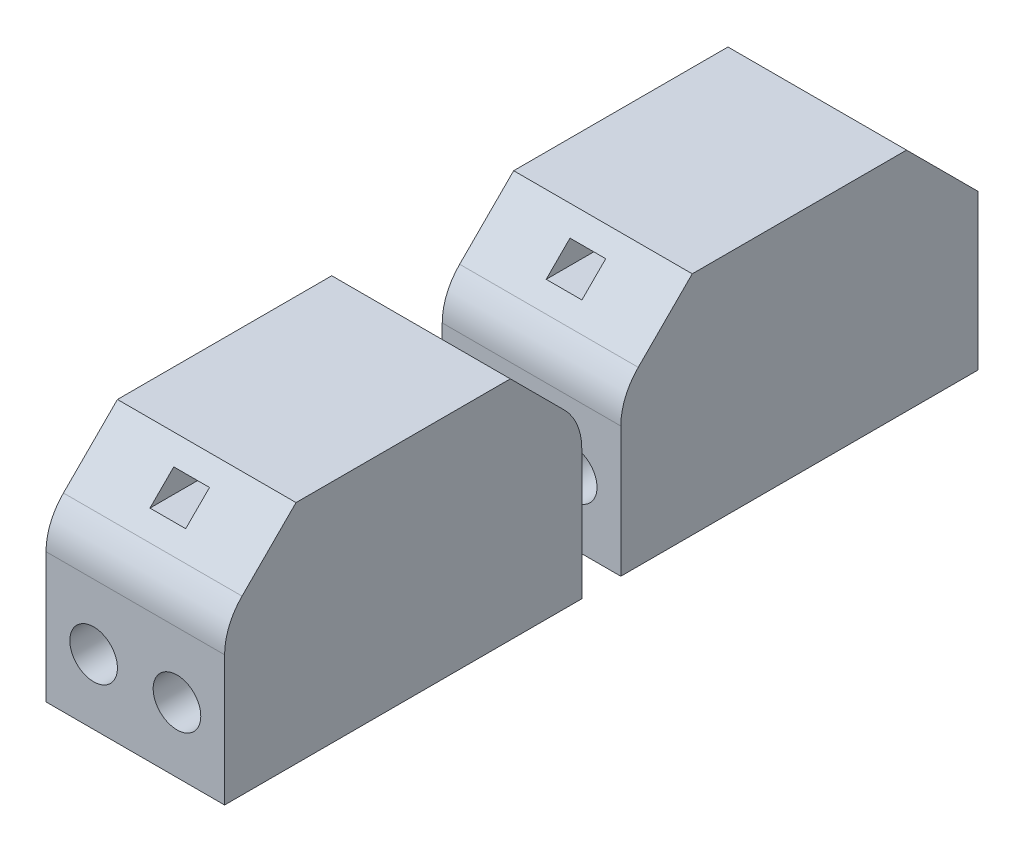
ISO-10303-21;
HEADER;
FILE_DESCRIPTION(('STEP AP214'),'2;1');
FILE_NAME('part.step','',(''),(''),'','','');
FILE_SCHEMA(('AUTOMOTIVE_DESIGN { 1 0 10303 214 1 1 1 1 }'));
ENDSEC;
DATA;
#1=APPLICATION_CONTEXT('core data for automotive mechanical design processes');
#2=APPLICATION_PROTOCOL_DEFINITION('international standard','automotive_design',2000,#1);
#3=PRODUCT_CONTEXT('',#1,'mechanical');
#4=PRODUCT('Part','Part','',(#3));
#5=PRODUCT_RELATED_PRODUCT_CATEGORY('part','',(#4));
#6=PRODUCT_DEFINITION_FORMATION('','',#4);
#7=PRODUCT_DEFINITION_CONTEXT('part definition',#1,'design');
#8=PRODUCT_DEFINITION('design','',#6,#7);
#9=PRODUCT_DEFINITION_SHAPE('','',#8);
#10=(LENGTH_UNIT() NAMED_UNIT(*) SI_UNIT(.MILLI.,.METRE.));
#11=(NAMED_UNIT(*) PLANE_ANGLE_UNIT() SI_UNIT($,.RADIAN.));
#12=(NAMED_UNIT(*) SI_UNIT($,.STERADIAN.) SOLID_ANGLE_UNIT());
#13=UNCERTAINTY_MEASURE_WITH_UNIT(LENGTH_MEASURE(1.E-05),#10,'distance_accuracy_value','');
#14=(GEOMETRIC_REPRESENTATION_CONTEXT(3) GLOBAL_UNCERTAINTY_ASSIGNED_CONTEXT((#13)) GLOBAL_UNIT_ASSIGNED_CONTEXT((#10,
#11,#12)) REPRESENTATION_CONTEXT('',''));
#15=CARTESIAN_POINT('',(0.,0.,0.));
#16=DIRECTION('',(0.,0.,1.));
#17=DIRECTION('',(1.,0.,0.));
#18=AXIS2_PLACEMENT_3D('',#15,#16,#17);
#19=CARTESIAN_POINT('',(7.5,-10.2167347703134,-31.3111852196648));
#20=DIRECTION('',(0.,-0.707106781186551,-0.707106781186544));
#21=DIRECTION('',(0.,0.707106781186544,-0.707106781186551));
#22=AXIS2_PLACEMENT_3D('',#19,#20,#21);
#23=PLANE('',#22);
#24=DIRECTION('',(1.,0.,0.));
#25=VECTOR('',#24,1.);
#26=CARTESIAN_POINT('',(7.5,-11.4845017232798,-30.0434182666984));
#27=LINE('',#26,#25);
#28=CARTESIAN_POINT('',(-1.5,-11.4845017232798,-30.0434182666984));
#29=VERTEX_POINT('',#28);
#30=CARTESIAN_POINT('',(1.5,-11.4845017232798,-30.0434182666984));
#31=VERTEX_POINT('',#30);
#32=EDGE_CURVE('E148',#29,#31,#27,.T.);
#33=ORIENTED_EDGE('',*,*,#32,.T.);
#34=DIRECTION('',(0.,-0.707106781186544,0.707106781186551));
#35=VECTOR('',#34,1.);
#36=CARTESIAN_POINT('',(1.5,-10.2167347703134,-31.3111852196648));
#37=LINE('',#36,#35);
#38=CARTESIAN_POINT('',(1.5,-13.4845017232798,-28.0434182666984));
#39=VERTEX_POINT('',#38);
#40=EDGE_CURVE('E150',#31,#39,#37,.T.);
#41=ORIENTED_EDGE('',*,*,#40,.T.);
#42=DIRECTION('',(-1.,0.,0.));
#43=VECTOR('',#42,1.);
#44=CARTESIAN_POINT('',(7.5,-13.4845017232798,-28.0434182666984));
#45=LINE('',#44,#43);
#46=CARTESIAN_POINT('',(-1.5,-13.4845017232798,-28.0434182666984));
#47=VERTEX_POINT('',#46);
#48=EDGE_CURVE('E168',#39,#47,#45,.T.);
#49=ORIENTED_EDGE('',*,*,#48,.T.);
#50=DIRECTION('',(0.,0.707106781186544,-0.707106781186551));
#51=VECTOR('',#50,1.);
#52=CARTESIAN_POINT('',(-1.5,-10.2167347703134,-31.3111852196648));
#53=LINE('',#52,#51);
#54=EDGE_CURVE('E167',#47,#29,#53,.T.);
#55=ORIENTED_EDGE('',*,*,#54,.T.);
#56=EDGE_LOOP('',(#33,#41,#49,#55));
#57=FACE_BOUND('',#56,.T.);
#58=DIRECTION('',(0.,-0.707106781186544,0.707106781186551));
#59=VECTOR('',#58,1.);
#60=CARTESIAN_POINT('',(-7.5,-10.2167347703134,-31.3111852196648));
#61=LINE('',#60,#59);
#62=CARTESIAN_POINT('',(-7.5,-10.2167347703134,-31.3111852196648));
#63=VERTEX_POINT('',#62);
#64=CARTESIAN_POINT('',(-7.5,-14.7522686762461,-26.775651313732));
#65=VERTEX_POINT('',#64);
#66=EDGE_CURVE('E180',#63,#65,#61,.T.);
#67=ORIENTED_EDGE('',*,*,#66,.T.);
#68=DIRECTION('',(-1.,0.,0.));
#69=VECTOR('',#68,1.);
#70=CARTESIAN_POINT('',(7.5,-14.7522686762461,-26.775651313732));
#71=LINE('',#70,#69);
#72=CARTESIAN_POINT('',(7.5,-14.7522686762461,-26.775651313732));
#73=VERTEX_POINT('',#72);
#74=EDGE_CURVE('E223',#65,#73,#71,.F.);
#75=ORIENTED_EDGE('',*,*,#74,.T.);
#76=DIRECTION('',(0.,-0.707106781186544,0.707106781186551));
#77=VECTOR('',#76,1.);
#78=CARTESIAN_POINT('',(7.5,-10.2167347703134,-31.3111852196648));
#79=LINE('',#78,#77);
#80=CARTESIAN_POINT('',(7.5,-10.2167347703134,-31.3111852196648));
#81=VERTEX_POINT('',#80);
#82=EDGE_CURVE('E178',#81,#73,#79,.T.);
#83=ORIENTED_EDGE('',*,*,#82,.F.);
#84=DIRECTION('',(-1.,0.,0.));
#85=VECTOR('',#84,1.);
#86=CARTESIAN_POINT('',(7.5,-10.2167347703134,-31.3111852196648));
#87=LINE('',#86,#85);
#88=EDGE_CURVE('E195',#81,#63,#87,.T.);
#89=ORIENTED_EDGE('',*,*,#88,.T.);
#90=EDGE_LOOP('',(#67,#75,#83,#89));
#91=FACE_BOUND('',#90,.T.);
#92=ADVANCED_FACE('F52',(#57,#91),#23,.F.);
#93=CARTESIAN_POINT('',(7.5,-16.2167347703134,-25.3111852196647));
#94=DIRECTION('',(0.,0.,-1.));
#95=DIRECTION('',(-1.,0.,0.));
#96=AXIS2_PLACEMENT_3D('',#93,#94,#95);
#97=PLANE('',#96);
#98=CARTESIAN_POINT('',(-3.5,-23.7522686762461,-25.3111852196647));
#99=DIRECTION('',(0.,0.,-1.));
#100=DIRECTION('',(-1.,0.,0.));
#101=AXIS2_PLACEMENT_3D('',#98,#99,#100);
#102=CIRCLE('',#101,2.);
#103=CARTESIAN_POINT('',(-5.5,-23.7522686762461,-25.3111852196647));
#104=VERTEX_POINT('',#103);
#105=EDGE_CURVE('E172',#104,#104,#102,.T.);
#106=ORIENTED_EDGE('',*,*,#105,.T.);
#107=EDGE_LOOP('',(#106));
#108=FACE_BOUND('',#107,.T.);
#109=CARTESIAN_POINT('',(3.5,-23.7522686762461,-25.3111852196647));
#110=DIRECTION('',(0.,0.,-1.));
#111=DIRECTION('',(-1.,0.,0.));
#112=AXIS2_PLACEMENT_3D('',#109,#110,#111);
#113=CIRCLE('',#112,2.);
#114=CARTESIAN_POINT('',(1.5,-23.7522686762461,-25.3111852196647));
#115=VERTEX_POINT('',#114);
#116=EDGE_CURVE('E163',#115,#115,#113,.T.);
#117=ORIENTED_EDGE('',*,*,#116,.T.);
#118=EDGE_LOOP('',(#117));
#119=FACE_BOUND('',#118,.T.);
#120=DIRECTION('',(0.,-1.,0.));
#121=VECTOR('',#120,1.);
#122=CARTESIAN_POINT('',(7.5,-16.2167347703134,-25.3111852196647));
#123=LINE('',#122,#121);
#124=CARTESIAN_POINT('',(7.5,-18.2878025821789,-25.3111852196647));
#125=VERTEX_POINT('',#124);
#126=CARTESIAN_POINT('',(7.5,-29.2167347703134,-25.3111852196647));
#127=VERTEX_POINT('',#126);
#128=EDGE_CURVE('E181',#125,#127,#123,.T.);
#129=ORIENTED_EDGE('',*,*,#128,.F.);
#130=DIRECTION('',(-1.,0.,0.));
#131=VECTOR('',#130,1.);
#132=CARTESIAN_POINT('',(7.5,-18.2878025821789,-25.3111852196647));
#133=LINE('',#132,#131);
#134=CARTESIAN_POINT('',(-7.5,-18.2878025821789,-25.3111852196647));
#135=VERTEX_POINT('',#134);
#136=EDGE_CURVE('E219',#125,#135,#133,.T.);
#137=ORIENTED_EDGE('',*,*,#136,.T.);
#138=DIRECTION('',(0.,-1.,0.));
#139=VECTOR('',#138,1.);
#140=CARTESIAN_POINT('',(-7.5,-16.2167347703134,-25.3111852196647));
#141=LINE('',#140,#139);
#142=CARTESIAN_POINT('',(-7.5,-29.2167347703134,-25.3111852196647));
#143=VERTEX_POINT('',#142);
#144=EDGE_CURVE('E194',#135,#143,#141,.T.);
#145=ORIENTED_EDGE('',*,*,#144,.T.);
#146=DIRECTION('',(-1.,0.,0.));
#147=VECTOR('',#146,1.);
#148=CARTESIAN_POINT('',(7.5,-29.2167347703134,-25.3111852196647));
#149=LINE('',#148,#147);
#150=EDGE_CURVE('E214',#127,#143,#149,.T.);
#151=ORIENTED_EDGE('',*,*,#150,.F.);
#152=EDGE_LOOP('',(#129,#137,#145,#151));
#153=FACE_BOUND('',#152,.T.);
#154=ADVANCED_FACE('F232',(#108,#119,#153),#97,.F.);
#155=CARTESIAN_POINT('',(7.5,-29.2167347703134,-25.3111852196647));
#156=DIRECTION('',(0.,1.,0.));
#157=DIRECTION('',(0.,0.,1.));
#158=AXIS2_PLACEMENT_3D('',#155,#156,#157);
#159=PLANE('',#158);
#160=DIRECTION('',(0.,0.,-1.));
#161=VECTOR('',#160,1.);
#162=CARTESIAN_POINT('',(-7.5,-29.2167347703134,-25.3111852196647));
#163=LINE('',#162,#161);
#164=CARTESIAN_POINT('',(-7.5,-29.2167347703134,-55.3111852196647));
#165=VERTEX_POINT('',#164);
#166=EDGE_CURVE('E200',#143,#165,#163,.T.);
#167=ORIENTED_EDGE('',*,*,#166,.T.);
#168=DIRECTION('',(-1.,0.,0.));
#169=VECTOR('',#168,1.);
#170=CARTESIAN_POINT('',(7.5,-29.2167347703134,-55.3111852196647));
#171=LINE('',#170,#169);
#172=CARTESIAN_POINT('',(7.5,-29.2167347703134,-55.3111852196647));
#173=VERTEX_POINT('',#172);
#174=EDGE_CURVE('E215',#173,#165,#171,.T.);
#175=ORIENTED_EDGE('',*,*,#174,.F.);
#176=DIRECTION('',(0.,0.,-1.));
#177=VECTOR('',#176,1.);
#178=CARTESIAN_POINT('',(7.5,-29.2167347703134,-25.3111852196647));
#179=LINE('',#178,#177);
#180=EDGE_CURVE('E183',#127,#173,#179,.T.);
#181=ORIENTED_EDGE('',*,*,#180,.F.);
#182=ORIENTED_EDGE('',*,*,#150,.T.);
#183=EDGE_LOOP('',(#167,#175,#181,#182));
#184=FACE_BOUND('',#183,.T.);
#185=ADVANCED_FACE('F257',(#184),#159,.F.);
#186=CARTESIAN_POINT('',(7.5,-29.2167347703134,-55.3111852196647));
#187=DIRECTION('',(0.,0.,1.));
#188=DIRECTION('',(1.,0.,0.));
#189=AXIS2_PLACEMENT_3D('',#186,#187,#188);
#190=PLANE('',#189);
#191=CARTESIAN_POINT('',(-3.5,-23.7522686762461,-55.3111852196647));
#192=DIRECTION('',(0.,0.,1.));
#193=DIRECTION('',(1.,0.,0.));
#194=AXIS2_PLACEMENT_3D('',#191,#192,#193);
#195=CIRCLE('',#194,2.);
#196=CARTESIAN_POINT('',(-1.5,-23.7522686762461,-55.3111852196647));
#197=VERTEX_POINT('',#196);
#198=EDGE_CURVE('E60',#197,#197,#195,.T.);
#199=ORIENTED_EDGE('',*,*,#198,.T.);
#200=EDGE_LOOP('',(#199));
#201=FACE_BOUND('',#200,.T.);
#202=CARTESIAN_POINT('',(3.5,-23.7522686762461,-55.3111852196647));
#203=DIRECTION('',(0.,0.,1.));
#204=DIRECTION('',(1.,0.,0.));
#205=AXIS2_PLACEMENT_3D('',#202,#203,#204);
#206=CIRCLE('',#205,2.);
#207=CARTESIAN_POINT('',(5.5,-23.7522686762461,-55.3111852196647));
#208=VERTEX_POINT('',#207);
#209=EDGE_CURVE('E159',#208,#208,#206,.T.);
#210=ORIENTED_EDGE('',*,*,#209,.T.);
#211=EDGE_LOOP('',(#210));
#212=FACE_BOUND('',#211,.T.);
#213=DIRECTION('',(0.,1.,0.));
#214=VECTOR('',#213,1.);
#215=CARTESIAN_POINT('',(-7.5,-29.2167347703134,-55.3111852196647));
#216=LINE('',#215,#214);
#217=CARTESIAN_POINT('',(-7.5,-16.2167347703134,-55.3111852196647));
#218=VERTEX_POINT('',#217);
#219=EDGE_CURVE('E196',#165,#218,#216,.T.);
#220=ORIENTED_EDGE('',*,*,#219,.T.);
#221=DIRECTION('',(-1.,0.,0.));
#222=VECTOR('',#221,1.);
#223=CARTESIAN_POINT('',(7.5,-16.2167347703134,-55.3111852196647));
#224=LINE('',#223,#222);
#225=CARTESIAN_POINT('',(7.5,-16.2167347703134,-55.3111852196647));
#226=VERTEX_POINT('',#225);
#227=EDGE_CURVE('E209',#226,#218,#224,.T.);
#228=ORIENTED_EDGE('',*,*,#227,.F.);
#229=DIRECTION('',(0.,1.,0.));
#230=VECTOR('',#229,1.);
#231=CARTESIAN_POINT('',(7.5,-29.2167347703134,-55.3111852196647));
#232=LINE('',#231,#230);
#233=EDGE_CURVE('E187',#173,#226,#232,.T.);
#234=ORIENTED_EDGE('',*,*,#233,.F.);
#235=ORIENTED_EDGE('',*,*,#174,.T.);
#236=EDGE_LOOP('',(#220,#228,#234,#235));
#237=FACE_BOUND('',#236,.T.);
#238=ADVANCED_FACE('F253',(#201,#212,#237),#190,.F.);
#239=CARTESIAN_POINT('',(7.5,-16.2167347703134,-55.3111852196647));
#240=DIRECTION('',(0.,-0.707106781186551,0.707106781186544));
#241=DIRECTION('',(0.,-0.707106781186544,-0.707106781186551));
#242=AXIS2_PLACEMENT_3D('',#239,#240,#241);
#243=PLANE('',#242);
#244=DIRECTION('',(1.,0.,0.));
#245=VECTOR('',#244,1.);
#246=CARTESIAN_POINT('',(7.5,-13.4845017232798,-52.5789521726311));
#247=LINE('',#246,#245);
#248=CARTESIAN_POINT('',(-1.5,-13.4845017232798,-52.5789521726311));
#249=VERTEX_POINT('',#248);
#250=CARTESIAN_POINT('',(1.5,-13.4845017232798,-52.5789521726311));
#251=VERTEX_POINT('',#250);
#252=EDGE_CURVE('E65',#249,#251,#247,.T.);
#253=ORIENTED_EDGE('',*,*,#252,.T.);
#254=DIRECTION('',(0.,0.707106781186544,0.707106781186551));
#255=VECTOR('',#254,1.);
#256=CARTESIAN_POINT('',(1.5,-16.2167347703134,-55.3111852196647));
#257=LINE('',#256,#255);
#258=CARTESIAN_POINT('',(1.5,-11.4845017232798,-50.5789521726311));
#259=VERTEX_POINT('',#258);
#260=EDGE_CURVE('E12',#251,#259,#257,.T.);
#261=ORIENTED_EDGE('',*,*,#260,.T.);
#262=DIRECTION('',(-1.,0.,0.));
#263=VECTOR('',#262,1.);
#264=CARTESIAN_POINT('',(7.5,-11.4845017232798,-50.5789521726311));
#265=LINE('',#264,#263);
#266=CARTESIAN_POINT('',(-1.5,-11.4845017232798,-50.5789521726311));
#267=VERTEX_POINT('',#266);
#268=EDGE_CURVE('E133',#259,#267,#265,.T.);
#269=ORIENTED_EDGE('',*,*,#268,.T.);
#270=DIRECTION('',(0.,-0.707106781186544,-0.707106781186551));
#271=VECTOR('',#270,1.);
#272=CARTESIAN_POINT('',(-1.5,-16.2167347703134,-55.3111852196647));
#273=LINE('',#272,#271);
#274=EDGE_CURVE('E139',#267,#249,#273,.T.);
#275=ORIENTED_EDGE('',*,*,#274,.T.);
#276=EDGE_LOOP('',(#253,#261,#269,#275));
#277=FACE_BOUND('',#276,.T.);
#278=DIRECTION('',(0.,0.707106781186544,0.707106781186552));
#279=VECTOR('',#278,1.);
#280=CARTESIAN_POINT('',(-7.5,-16.2167347703134,-55.3111852196647));
#281=LINE('',#280,#279);
#282=CARTESIAN_POINT('',(-7.5,-10.2167347703134,-49.3111852196647));
#283=VERTEX_POINT('',#282);
#284=EDGE_CURVE('E202',#218,#283,#281,.T.);
#285=ORIENTED_EDGE('',*,*,#284,.T.);
#286=DIRECTION('',(-1.,0.,0.));
#287=VECTOR('',#286,1.);
#288=CARTESIAN_POINT('',(7.5,-10.2167347703134,-49.3111852196647));
#289=LINE('',#288,#287);
#290=CARTESIAN_POINT('',(7.5,-10.2167347703134,-49.3111852196647));
#291=VERTEX_POINT('',#290);
#292=EDGE_CURVE('E207',#291,#283,#289,.T.);
#293=ORIENTED_EDGE('',*,*,#292,.F.);
#294=DIRECTION('',(0.,0.707106781186544,0.707106781186552));
#295=VECTOR('',#294,1.);
#296=CARTESIAN_POINT('',(7.5,-16.2167347703134,-55.3111852196647));
#297=LINE('',#296,#295);
#298=EDGE_CURVE('E189',#226,#291,#297,.T.);
#299=ORIENTED_EDGE('',*,*,#298,.F.);
#300=ORIENTED_EDGE('',*,*,#227,.T.);
#301=EDGE_LOOP('',(#285,#293,#299,#300));
#302=FACE_BOUND('',#301,.T.);
#303=ADVANCED_FACE('F155',(#277,#302),#243,.F.);
#304=CARTESIAN_POINT('',(7.5,-10.2167347703134,-49.3111852196647));
#305=DIRECTION('',(0.,-1.,0.));
#306=DIRECTION('',(0.,0.,-1.));
#307=AXIS2_PLACEMENT_3D('',#304,#305,#306);
#308=PLANE('',#307);
#309=DIRECTION('',(0.,0.,1.));
#310=VECTOR('',#309,1.);
#311=CARTESIAN_POINT('',(-7.5,-10.2167347703134,-49.3111852196647));
#312=LINE('',#311,#310);
#313=EDGE_CURVE('E185',#283,#63,#312,.T.);
#314=ORIENTED_EDGE('',*,*,#313,.T.);
#315=ORIENTED_EDGE('',*,*,#88,.F.);
#316=DIRECTION('',(0.,0.,1.));
#317=VECTOR('',#316,1.);
#318=CARTESIAN_POINT('',(7.5,-10.2167347703134,-49.3111852196647));
#319=LINE('',#318,#317);
#320=EDGE_CURVE('E188',#291,#81,#319,.T.);
#321=ORIENTED_EDGE('',*,*,#320,.F.);
#322=ORIENTED_EDGE('',*,*,#292,.T.);
#323=EDGE_LOOP('',(#314,#315,#321,#322));
#324=FACE_BOUND('',#323,.T.);
#325=ADVANCED_FACE('F250',(#324),#308,.F.);
#326=CARTESIAN_POINT('',(7.5,0.,0.));
#327=DIRECTION('',(-1.,0.,0.));
#328=DIRECTION('',(0.,0.,1.));
#329=AXIS2_PLACEMENT_3D('',#326,#327,#328);
#330=PLANE('',#329);
#331=ORIENTED_EDGE('',*,*,#82,.T.);
#332=CARTESIAN_POINT('',(7.5,-18.2878025821789,-30.3111852196647));
#333=DIRECTION('',(-1.,0.,0.));
#334=DIRECTION('',(0.,0.,1.));
#335=AXIS2_PLACEMENT_3D('',#332,#333,#334);
#336=CIRCLE('',#335,5.);
#337=EDGE_CURVE('E136',#73,#125,#336,.F.);
#338=ORIENTED_EDGE('',*,*,#337,.T.);
#339=ORIENTED_EDGE('',*,*,#128,.T.);
#340=ORIENTED_EDGE('',*,*,#180,.T.);
#341=ORIENTED_EDGE('',*,*,#233,.T.);
#342=ORIENTED_EDGE('',*,*,#298,.T.);
#343=ORIENTED_EDGE('',*,*,#320,.T.);
#344=EDGE_LOOP('',(#331,#338,#339,#340,#341,#342,#343));
#345=FACE_BOUND('',#344,.T.);
#346=ADVANCED_FACE('F226',(#345),#330,.F.);
#347=CARTESIAN_POINT('',(-7.5,0.,0.));
#348=DIRECTION('',(-1.,0.,0.));
#349=DIRECTION('',(0.,0.,1.));
#350=AXIS2_PLACEMENT_3D('',#347,#348,#349);
#351=PLANE('',#350);
#352=ORIENTED_EDGE('',*,*,#144,.F.);
#353=CARTESIAN_POINT('',(-7.5,-18.2878025821789,-30.3111852196647));
#354=DIRECTION('',(-1.,0.,0.));
#355=DIRECTION('',(0.,0.,1.));
#356=AXIS2_PLACEMENT_3D('',#353,#354,#355);
#357=CIRCLE('',#356,5.);
#358=EDGE_CURVE('E222',#135,#65,#357,.T.);
#359=ORIENTED_EDGE('',*,*,#358,.T.);
#360=ORIENTED_EDGE('',*,*,#66,.F.);
#361=ORIENTED_EDGE('',*,*,#313,.F.);
#362=ORIENTED_EDGE('',*,*,#284,.F.);
#363=ORIENTED_EDGE('',*,*,#219,.F.);
#364=ORIENTED_EDGE('',*,*,#166,.F.);
#365=EDGE_LOOP('',(#352,#359,#360,#361,#362,#363,#364));
#366=FACE_BOUND('',#365,.T.);
#367=ADVANCED_FACE('F239',(#366),#351,.T.);
#368=CARTESIAN_POINT('',(7.5,-18.2878025821789,-30.3111852196647));
#369=DIRECTION('',(-1.,0.,0.));
#370=DIRECTION('',(0.,0.,1.));
#371=AXIS2_PLACEMENT_3D('',#368,#369,#370);
#372=CYLINDRICAL_SURFACE('',#371,5.);
#373=ORIENTED_EDGE('',*,*,#337,.F.);
#374=ORIENTED_EDGE('',*,*,#74,.F.);
#375=ORIENTED_EDGE('',*,*,#358,.F.);
#376=ORIENTED_EDGE('',*,*,#136,.F.);
#377=EDGE_LOOP('',(#373,#374,#375,#376));
#378=FACE_BOUND('',#377,.T.);
#379=ADVANCED_FACE('F54',(#378),#372,.T.);
#380=CARTESIAN_POINT('',(1.5,-11.4845017232798,-100.));
#381=DIRECTION('',(1.,0.,0.));
#382=DIRECTION('',(0.,1.,0.));
#383=AXIS2_PLACEMENT_3D('',#380,#381,#382);
#384=PLANE('',#383);
#385=DIRECTION('',(0.,0.,1.));
#386=VECTOR('',#385,1.);
#387=CARTESIAN_POINT('',(1.5,-11.4845017232798,-100.));
#388=LINE('',#387,#386);
#389=EDGE_CURVE('E68',#259,#31,#388,.T.);
#390=ORIENTED_EDGE('',*,*,#389,.F.);
#391=ORIENTED_EDGE('',*,*,#260,.F.);
#392=DIRECTION('',(0.,0.,1.));
#393=VECTOR('',#392,1.);
#394=CARTESIAN_POINT('',(1.5,-13.4845017232798,-100.));
#395=LINE('',#394,#393);
#396=EDGE_CURVE('E280',#251,#39,#395,.T.);
#397=ORIENTED_EDGE('',*,*,#396,.T.);
#398=ORIENTED_EDGE('',*,*,#40,.F.);
#399=EDGE_LOOP('',(#390,#391,#397,#398));
#400=FACE_BOUND('',#399,.T.);
#401=ADVANCED_FACE('F141',(#400),#384,.F.);
#402=CARTESIAN_POINT('',(-1.5,-13.4845017232798,-100.));
#403=DIRECTION('',(0.,-1.,0.));
#404=DIRECTION('',(0.,0.,-1.));
#405=AXIS2_PLACEMENT_3D('',#402,#403,#404);
#406=PLANE('',#405);
#407=ORIENTED_EDGE('',*,*,#396,.F.);
#408=ORIENTED_EDGE('',*,*,#252,.F.);
#409=DIRECTION('',(0.,0.,1.));
#410=VECTOR('',#409,1.);
#411=CARTESIAN_POINT('',(-1.5,-13.4845017232798,-100.));
#412=LINE('',#411,#410);
#413=EDGE_CURVE('E278',#249,#47,#412,.T.);
#414=ORIENTED_EDGE('',*,*,#413,.T.);
#415=ORIENTED_EDGE('',*,*,#48,.F.);
#416=EDGE_LOOP('',(#407,#408,#414,#415));
#417=FACE_BOUND('',#416,.T.);
#418=ADVANCED_FACE('F284',(#417),#406,.F.);
#419=CARTESIAN_POINT('',(-1.5,-11.4845017232798,-100.));
#420=DIRECTION('',(-1.,0.,0.));
#421=DIRECTION('',(0.,-1.,0.));
#422=AXIS2_PLACEMENT_3D('',#419,#420,#421);
#423=PLANE('',#422);
#424=ORIENTED_EDGE('',*,*,#413,.F.);
#425=ORIENTED_EDGE('',*,*,#274,.F.);
#426=DIRECTION('',(0.,0.,1.));
#427=VECTOR('',#426,1.);
#428=CARTESIAN_POINT('',(-1.5,-11.4845017232798,-100.));
#429=LINE('',#428,#427);
#430=EDGE_CURVE('E71',#267,#29,#429,.T.);
#431=ORIENTED_EDGE('',*,*,#430,.T.);
#432=ORIENTED_EDGE('',*,*,#54,.F.);
#433=EDGE_LOOP('',(#424,#425,#431,#432));
#434=FACE_BOUND('',#433,.T.);
#435=ADVANCED_FACE('F285',(#434),#423,.F.);
#436=CARTESIAN_POINT('',(-1.5,-11.4845017232798,-100.));
#437=DIRECTION('',(0.,1.,0.));
#438=DIRECTION('',(0.,0.,1.));
#439=AXIS2_PLACEMENT_3D('',#436,#437,#438);
#440=PLANE('',#439);
#441=ORIENTED_EDGE('',*,*,#430,.F.);
#442=ORIENTED_EDGE('',*,*,#268,.F.);
#443=ORIENTED_EDGE('',*,*,#389,.T.);
#444=ORIENTED_EDGE('',*,*,#32,.F.);
#445=EDGE_LOOP('',(#441,#442,#443,#444));
#446=FACE_BOUND('',#445,.T.);
#447=ADVANCED_FACE('F137',(#446),#440,.F.);
#448=CARTESIAN_POINT('',(3.5,-23.7522686762461,-100.));
#449=DIRECTION('',(0.,0.,1.));
#450=DIRECTION('',(1.,0.,0.));
#451=AXIS2_PLACEMENT_3D('',#448,#449,#450);
#452=CYLINDRICAL_SURFACE('',#451,2.);
#453=ORIENTED_EDGE('',*,*,#209,.F.);
#454=EDGE_LOOP('',(#453));
#455=FACE_BOUND('',#454,.T.);
#456=ORIENTED_EDGE('',*,*,#116,.F.);
#457=EDGE_LOOP('',(#456));
#458=FACE_BOUND('',#457,.T.);
#459=ADVANCED_FACE('F331',(#455,#458),#452,.F.);
#460=CARTESIAN_POINT('',(-3.5,-23.7522686762461,-100.));
#461=DIRECTION('',(0.,0.,1.));
#462=DIRECTION('',(1.,0.,0.));
#463=AXIS2_PLACEMENT_3D('',#460,#461,#462);
#464=CYLINDRICAL_SURFACE('',#463,2.);
#465=ORIENTED_EDGE('',*,*,#198,.F.);
#466=EDGE_LOOP('',(#465));
#467=FACE_BOUND('',#466,.T.);
#468=ORIENTED_EDGE('',*,*,#105,.F.);
#469=EDGE_LOOP('',(#468));
#470=FACE_BOUND('',#469,.T.);
#471=ADVANCED_FACE('F342',(#467,#470),#464,.F.);
#472=CLOSED_SHELL('',(#92,#154,#185,#238,#303,#325,#346,#367,#379,#401,#418,#435,#447,#459,#471));
#473=MANIFOLD_SOLID_BREP('B2',#472);
#474=CARTESIAN_POINT('',(7.5,-29.2167347703134,-22.0328397192485));
#475=DIRECTION('',(0.,1.,0.));
#476=DIRECTION('',(0.,0.,1.));
#477=AXIS2_PLACEMENT_3D('',#474,#475,#476);
#478=PLANE('',#477);
#479=DIRECTION('',(0.,0.,-1.));
#480=VECTOR('',#479,1.);
#481=CARTESIAN_POINT('',(-7.5,-29.2167347703134,-22.0328397192485));
#482=LINE('',#481,#480);
#483=CARTESIAN_POINT('',(-7.5,-29.2167347703134,7.96716028075147));
#484=VERTEX_POINT('',#483);
#485=CARTESIAN_POINT('',(-7.5,-29.2167347703134,-22.0328397192485));
#486=VERTEX_POINT('',#485);
#487=EDGE_CURVE('E508',#484,#486,#482,.T.);
#488=ORIENTED_EDGE('',*,*,#487,.T.);
#489=DIRECTION('',(-1.,0.,0.));
#490=VECTOR('',#489,1.);
#491=CARTESIAN_POINT('',(7.5,-29.2167347703134,-22.0328397192485));
#492=LINE('',#491,#490);
#493=CARTESIAN_POINT('',(7.5,-29.2167347703134,-22.0328397192485));
#494=VERTEX_POINT('',#493);
#495=EDGE_CURVE('E552',#494,#486,#492,.T.);
#496=ORIENTED_EDGE('',*,*,#495,.F.);
#497=DIRECTION('',(0.,0.,-1.));
#498=VECTOR('',#497,1.);
#499=CARTESIAN_POINT('',(7.5,-29.2167347703134,-22.0328397192485));
#500=LINE('',#499,#498);
#501=CARTESIAN_POINT('',(7.5,-29.2167347703134,7.96716028075147));
#502=VERTEX_POINT('',#501);
#503=EDGE_CURVE('E520',#502,#494,#500,.T.);
#504=ORIENTED_EDGE('',*,*,#503,.F.);
#505=DIRECTION('',(-1.,0.,0.));
#506=VECTOR('',#505,1.);
#507=CARTESIAN_POINT('',(7.5,-29.2167347703134,7.96716028075147));
#508=LINE('',#507,#506);
#509=EDGE_CURVE('E535',#502,#484,#508,.T.);
#510=ORIENTED_EDGE('',*,*,#509,.T.);
#511=EDGE_LOOP('',(#488,#496,#504,#510));
#512=FACE_BOUND('',#511,.T.);
#513=ADVANCED_FACE('F401',(#512),#478,.F.);
#514=CARTESIAN_POINT('',(7.5,-16.2167347703134,-22.0328397192485));
#515=DIRECTION('',(0.,0.,1.));
#516=DIRECTION('',(0.,-1.,0.));
#517=AXIS2_PLACEMENT_3D('',#514,#515,#516);
#518=PLANE('',#517);
#519=CARTESIAN_POINT('',(-3.5,-23.7522686762461,-22.0328397192485));
#520=DIRECTION('',(0.,0.,1.));
#521=DIRECTION('',(0.,-1.,0.));
#522=AXIS2_PLACEMENT_3D('',#519,#520,#521);
#523=CIRCLE('',#522,2.);
#524=CARTESIAN_POINT('',(-3.5,-25.7522686762461,-22.0328397192485));
#525=VERTEX_POINT('',#524);
#526=EDGE_CURVE('E492',#525,#525,#523,.T.);
#527=ORIENTED_EDGE('',*,*,#526,.T.);
#528=EDGE_LOOP('',(#527));
#529=FACE_BOUND('',#528,.T.);
#530=CARTESIAN_POINT('',(3.5,-23.7522686762461,-22.0328397192485));
#531=DIRECTION('',(0.,0.,1.));
#532=DIRECTION('',(0.,-1.,0.));
#533=AXIS2_PLACEMENT_3D('',#530,#531,#532);
#534=CIRCLE('',#533,2.);
#535=CARTESIAN_POINT('',(3.5,-25.7522686762461,-22.0328397192485));
#536=VERTEX_POINT('',#535);
#537=EDGE_CURVE('E577',#536,#536,#534,.T.);
#538=ORIENTED_EDGE('',*,*,#537,.T.);
#539=EDGE_LOOP('',(#538));
#540=FACE_BOUND('',#539,.T.);
#541=DIRECTION('',(0.,1.,0.));
#542=VECTOR('',#541,1.);
#543=CARTESIAN_POINT('',(-7.5,-16.2167347703134,-22.0328397192485));
#544=LINE('',#543,#542);
#545=CARTESIAN_POINT('',(-7.5,-18.2878025821789,-22.0328397192485));
#546=VERTEX_POINT('',#545);
#547=EDGE_CURVE('E515',#486,#546,#544,.T.);
#548=ORIENTED_EDGE('',*,*,#547,.T.);
#549=DIRECTION('',(-1.,0.,0.));
#550=VECTOR('',#549,1.);
#551=CARTESIAN_POINT('',(7.5,-18.2878025821789,-22.0328397192485));
#552=LINE('',#551,#550);
#553=CARTESIAN_POINT('',(7.5,-18.2878025821789,-22.0328397192485));
#554=VERTEX_POINT('',#553);
#555=EDGE_CURVE('E571',#546,#554,#552,.F.);
#556=ORIENTED_EDGE('',*,*,#555,.T.);
#557=DIRECTION('',(0.,1.,0.));
#558=VECTOR('',#557,1.);
#559=CARTESIAN_POINT('',(7.5,-16.2167347703134,-22.0328397192485));
#560=LINE('',#559,#558);
#561=EDGE_CURVE('E519',#494,#554,#560,.T.);
#562=ORIENTED_EDGE('',*,*,#561,.F.);
#563=ORIENTED_EDGE('',*,*,#495,.T.);
#564=EDGE_LOOP('',(#548,#556,#562,#563));
#565=FACE_BOUND('',#564,.T.);
#566=ADVANCED_FACE('F612',(#529,#540,#565),#518,.F.);
#567=CARTESIAN_POINT('',(7.5,-10.2167347703134,-16.0328397192485));
#568=DIRECTION('',(0.,-0.707106781186551,0.707106781186544));
#569=DIRECTION('',(0.,-0.707106781186544,-0.707106781186551));
#570=AXIS2_PLACEMENT_3D('',#567,#568,#569);
#571=PLANE('',#570);
#572=DIRECTION('',(1.,0.,0.));
#573=VECTOR('',#572,1.);
#574=CARTESIAN_POINT('',(7.5,-13.4845017232798,-19.3006066722149));
#575=LINE('',#574,#573);
#576=CARTESIAN_POINT('',(-1.5,-13.4845017232798,-19.3006066722149));
#577=VERTEX_POINT('',#576);
#578=CARTESIAN_POINT('',(1.5,-13.4845017232798,-19.3006066722149));
#579=VERTEX_POINT('',#578);
#580=EDGE_CURVE('E507',#577,#579,#575,.T.);
#581=ORIENTED_EDGE('',*,*,#580,.T.);
#582=DIRECTION('',(0.,0.707106781186544,0.707106781186551));
#583=VECTOR('',#582,1.);
#584=CARTESIAN_POINT('',(1.5,-10.2167347703134,-16.0328397192485));
#585=LINE('',#584,#583);
#586=CARTESIAN_POINT('',(1.5,-11.4845017232798,-17.3006066722149));
#587=VERTEX_POINT('',#586);
#588=EDGE_CURVE('E499',#579,#587,#585,.T.);
#589=ORIENTED_EDGE('',*,*,#588,.T.);
#590=DIRECTION('',(-1.,0.,0.));
#591=VECTOR('',#590,1.);
#592=CARTESIAN_POINT('',(7.5,-11.4845017232798,-17.3006066722148));
#593=LINE('',#592,#591);
#594=CARTESIAN_POINT('',(-1.5,-11.4845017232798,-17.3006066722148));
#595=VERTEX_POINT('',#594);
#596=EDGE_CURVE('E490',#587,#595,#593,.T.);
#597=ORIENTED_EDGE('',*,*,#596,.T.);
#598=DIRECTION('',(0.,-0.707106781186544,-0.707106781186551));
#599=VECTOR('',#598,1.);
#600=CARTESIAN_POINT('',(-1.5,-10.2167347703134,-16.0328397192485));
#601=LINE('',#600,#599);
#602=EDGE_CURVE('E494',#595,#577,#601,.T.);
#603=ORIENTED_EDGE('',*,*,#602,.T.);
#604=EDGE_LOOP('',(#581,#589,#597,#603));
#605=FACE_BOUND('',#604,.T.);
#606=DIRECTION('',(0.,0.707106781186544,0.707106781186551));
#607=VECTOR('',#606,1.);
#608=CARTESIAN_POINT('',(7.5,-10.2167347703134,-16.0328397192485));
#609=LINE('',#608,#607);
#610=CARTESIAN_POINT('',(7.5,-14.7522686762461,-20.5683736251812));
#611=VERTEX_POINT('',#610);
#612=CARTESIAN_POINT('',(7.5,-10.2167347703134,-16.0328397192485));
#613=VERTEX_POINT('',#612);
#614=EDGE_CURVE('E521',#611,#613,#609,.T.);
#615=ORIENTED_EDGE('',*,*,#614,.F.);
#616=DIRECTION('',(-1.,0.,0.));
#617=VECTOR('',#616,1.);
#618=CARTESIAN_POINT('',(7.5,-14.7522686762461,-20.5683736251812));
#619=LINE('',#618,#617);
#620=CARTESIAN_POINT('',(-7.5,-14.7522686762461,-20.5683736251812));
#621=VERTEX_POINT('',#620);
#622=EDGE_CURVE('E568',#611,#621,#619,.T.);
#623=ORIENTED_EDGE('',*,*,#622,.T.);
#624=DIRECTION('',(0.,0.707106781186544,0.707106781186551));
#625=VECTOR('',#624,1.);
#626=CARTESIAN_POINT('',(-7.5,-10.2167347703134,-16.0328397192485));
#627=LINE('',#626,#625);
#628=CARTESIAN_POINT('',(-7.5,-10.2167347703134,-16.0328397192485));
#629=VERTEX_POINT('',#628);
#630=EDGE_CURVE('E536',#621,#629,#627,.T.);
#631=ORIENTED_EDGE('',*,*,#630,.T.);
#632=DIRECTION('',(-1.,0.,0.));
#633=VECTOR('',#632,1.);
#634=CARTESIAN_POINT('',(7.5,-10.2167347703134,-16.0328397192485));
#635=LINE('',#634,#633);
#636=EDGE_CURVE('E549',#613,#629,#635,.T.);
#637=ORIENTED_EDGE('',*,*,#636,.F.);
#638=EDGE_LOOP('',(#615,#623,#631,#637));
#639=FACE_BOUND('',#638,.T.);
#640=ADVANCED_FACE('F506',(#605,#639),#571,.F.);
#641=CARTESIAN_POINT('',(7.5,-10.2167347703134,1.9671602807514));
#642=DIRECTION('',(0.,-1.,0.));
#643=DIRECTION('',(0.,0.,-1.));
#644=AXIS2_PLACEMENT_3D('',#641,#642,#643);
#645=PLANE('',#644);
#646=DIRECTION('',(0.,0.,1.));
#647=VECTOR('',#646,1.);
#648=CARTESIAN_POINT('',(-7.5,-10.2167347703134,1.9671602807514));
#649=LINE('',#648,#647);
#650=CARTESIAN_POINT('',(-7.5,-10.2167347703134,1.9671602807514));
#651=VERTEX_POINT('',#650);
#652=EDGE_CURVE('E537',#629,#651,#649,.T.);
#653=ORIENTED_EDGE('',*,*,#652,.T.);
#654=DIRECTION('',(-1.,0.,0.));
#655=VECTOR('',#654,1.);
#656=CARTESIAN_POINT('',(7.5,-10.2167347703134,1.9671602807514));
#657=LINE('',#656,#655);
#658=CARTESIAN_POINT('',(7.5,-10.2167347703134,1.9671602807514));
#659=VERTEX_POINT('',#658);
#660=EDGE_CURVE('E547',#659,#651,#657,.T.);
#661=ORIENTED_EDGE('',*,*,#660,.F.);
#662=DIRECTION('',(0.,0.,1.));
#663=VECTOR('',#662,1.);
#664=CARTESIAN_POINT('',(7.5,-10.2167347703134,1.9671602807514));
#665=LINE('',#664,#663);
#666=EDGE_CURVE('E527',#613,#659,#665,.T.);
#667=ORIENTED_EDGE('',*,*,#666,.F.);
#668=ORIENTED_EDGE('',*,*,#636,.T.);
#669=EDGE_LOOP('',(#653,#661,#667,#668));
#670=FACE_BOUND('',#669,.T.);
#671=ADVANCED_FACE('F658',(#670),#645,.F.);
#672=CARTESIAN_POINT('',(7.5,-16.2167347703134,7.96716028075146));
#673=DIRECTION('',(0.,-0.707106781186551,-0.707106781186544));
#674=DIRECTION('',(0.,0.707106781186544,-0.707106781186551));
#675=AXIS2_PLACEMENT_3D('',#672,#673,#674);
#676=PLANE('',#675);
#677=DIRECTION('',(1.,0.,0.));
#678=VECTOR('',#677,1.);
#679=CARTESIAN_POINT('',(7.5,-11.4845017232798,3.23492723371778));
#680=LINE('',#679,#678);
#681=CARTESIAN_POINT('',(-1.5,-11.4845017232798,3.23492723371778));
#682=VERTEX_POINT('',#681);
#683=CARTESIAN_POINT('',(1.5,-11.4845017232798,3.23492723371778));
#684=VERTEX_POINT('',#683);
#685=EDGE_CURVE('E572',#682,#684,#680,.T.);
#686=ORIENTED_EDGE('',*,*,#685,.T.);
#687=DIRECTION('',(0.,-0.707106781186544,0.707106781186551));
#688=VECTOR('',#687,1.);
#689=CARTESIAN_POINT('',(1.5,-16.2167347703134,7.96716028075146));
#690=LINE('',#689,#688);
#691=CARTESIAN_POINT('',(1.5,-13.4845017232798,5.2349272337178));
#692=VERTEX_POINT('',#691);
#693=EDGE_CURVE('E51',#684,#692,#690,.T.);
#694=ORIENTED_EDGE('',*,*,#693,.T.);
#695=DIRECTION('',(-1.,0.,0.));
#696=VECTOR('',#695,1.);
#697=CARTESIAN_POINT('',(7.5,-13.4845017232798,5.2349272337178));
#698=LINE('',#697,#696);
#699=CARTESIAN_POINT('',(-1.5,-13.4845017232798,5.23492723371782));
#700=VERTEX_POINT('',#699);
#701=EDGE_CURVE('E412',#692,#700,#698,.T.);
#702=ORIENTED_EDGE('',*,*,#701,.T.);
#703=DIRECTION('',(0.,0.707106781186544,-0.707106781186551));
#704=VECTOR('',#703,1.);
#705=CARTESIAN_POINT('',(-1.5,-16.2167347703134,7.96716028075146));
#706=LINE('',#705,#704);
#707=EDGE_CURVE('E581',#700,#682,#706,.T.);
#708=ORIENTED_EDGE('',*,*,#707,.T.);
#709=EDGE_LOOP('',(#686,#694,#702,#708));
#710=FACE_BOUND('',#709,.T.);
#711=DIRECTION('',(0.,-0.707106781186544,0.707106781186551));
#712=VECTOR('',#711,1.);
#713=CARTESIAN_POINT('',(-7.5,-16.2167347703134,7.96716028075146));
#714=LINE('',#713,#712);
#715=CARTESIAN_POINT('',(-7.5,-14.7522686762461,6.50269418668418));
#716=VERTEX_POINT('',#715);
#717=EDGE_CURVE('E539',#651,#716,#714,.T.);
#718=ORIENTED_EDGE('',*,*,#717,.T.);
#719=DIRECTION('',(-1.,0.,0.));
#720=VECTOR('',#719,1.);
#721=CARTESIAN_POINT('',(7.5,-14.7522686762461,6.50269418668418));
#722=LINE('',#721,#720);
#723=CARTESIAN_POINT('',(7.5,-14.7522686762461,6.50269418668418));
#724=VERTEX_POINT('',#723);
#725=EDGE_CURVE('E565',#716,#724,#722,.F.);
#726=ORIENTED_EDGE('',*,*,#725,.T.);
#727=DIRECTION('',(0.,-0.707106781186544,0.707106781186551));
#728=VECTOR('',#727,1.);
#729=CARTESIAN_POINT('',(7.5,-16.2167347703134,7.96716028075146));
#730=LINE('',#729,#728);
#731=EDGE_CURVE('E528',#659,#724,#730,.T.);
#732=ORIENTED_EDGE('',*,*,#731,.F.);
#733=ORIENTED_EDGE('',*,*,#660,.T.);
#734=EDGE_LOOP('',(#718,#726,#732,#733));
#735=FACE_BOUND('',#734,.T.);
#736=ADVANCED_FACE('F584',(#710,#735),#676,.F.);
#737=CARTESIAN_POINT('',(7.5,-29.2167347703134,7.96716028075147));
#738=DIRECTION('',(0.,0.,-1.));
#739=DIRECTION('',(0.,1.,0.));
#740=AXIS2_PLACEMENT_3D('',#737,#738,#739);
#741=PLANE('',#740);
#742=CARTESIAN_POINT('',(-3.5,-23.7522686762461,7.96716028075146));
#743=DIRECTION('',(0.,0.,-1.));
#744=DIRECTION('',(0.,1.,0.));
#745=AXIS2_PLACEMENT_3D('',#742,#743,#744);
#746=CIRCLE('',#745,2.);
#747=CARTESIAN_POINT('',(-3.5,-21.7522686762461,7.96716028075146));
#748=VERTEX_POINT('',#747);
#749=EDGE_CURVE('E580',#748,#748,#746,.T.);
#750=ORIENTED_EDGE('',*,*,#749,.T.);
#751=EDGE_LOOP('',(#750));
#752=FACE_BOUND('',#751,.T.);
#753=CARTESIAN_POINT('',(3.5,-23.7522686762461,7.96716028075146));
#754=DIRECTION('',(0.,0.,-1.));
#755=DIRECTION('',(0.,1.,0.));
#756=AXIS2_PLACEMENT_3D('',#753,#754,#755);
#757=CIRCLE('',#756,2.);
#758=CARTESIAN_POINT('',(3.5,-21.7522686762461,7.96716028075146));
#759=VERTEX_POINT('',#758);
#760=EDGE_CURVE('E503',#759,#759,#757,.T.);
#761=ORIENTED_EDGE('',*,*,#760,.T.);
#762=EDGE_LOOP('',(#761));
#763=FACE_BOUND('',#762,.T.);
#764=DIRECTION('',(0.,-1.,0.));
#765=VECTOR('',#764,1.);
#766=CARTESIAN_POINT('',(7.5,-29.2167347703134,7.96716028075147));
#767=LINE('',#766,#765);
#768=CARTESIAN_POINT('',(7.5,-18.2878025821789,7.96716028075146));
#769=VERTEX_POINT('',#768);
#770=EDGE_CURVE('E532',#769,#502,#767,.T.);
#771=ORIENTED_EDGE('',*,*,#770,.F.);
#772=DIRECTION('',(-1.,0.,0.));
#773=VECTOR('',#772,1.);
#774=CARTESIAN_POINT('',(7.5,-18.2878025821789,7.96716028075146));
#775=LINE('',#774,#773);
#776=CARTESIAN_POINT('',(-7.5,-18.2878025821789,7.96716028075146));
#777=VERTEX_POINT('',#776);
#778=EDGE_CURVE('E554',#769,#777,#775,.T.);
#779=ORIENTED_EDGE('',*,*,#778,.T.);
#780=DIRECTION('',(0.,-1.,0.));
#781=VECTOR('',#780,1.);
#782=CARTESIAN_POINT('',(-7.5,-29.2167347703134,7.96716028075147));
#783=LINE('',#782,#781);
#784=EDGE_CURVE('E522',#777,#484,#783,.T.);
#785=ORIENTED_EDGE('',*,*,#784,.T.);
#786=ORIENTED_EDGE('',*,*,#509,.F.);
#787=EDGE_LOOP('',(#771,#779,#785,#786));
#788=FACE_BOUND('',#787,.T.);
#789=ADVANCED_FACE('F645',(#752,#763,#788),#741,.F.);
#790=CARTESIAN_POINT('',(7.5,0.,0.));
#791=DIRECTION('',(-1.,0.,0.));
#792=DIRECTION('',(0.,0.,1.));
#793=AXIS2_PLACEMENT_3D('',#790,#791,#792);
#794=PLANE('',#793);
#795=ORIENTED_EDGE('',*,*,#731,.T.);
#796=CARTESIAN_POINT('',(7.5,-18.2878025821789,2.96716028075146));
#797=DIRECTION('',(-1.,0.,0.));
#798=DIRECTION('',(0.,0.,1.));
#799=AXIS2_PLACEMENT_3D('',#796,#797,#798);
#800=CIRCLE('',#799,5.);
#801=EDGE_CURVE('E566',#724,#769,#800,.F.);
#802=ORIENTED_EDGE('',*,*,#801,.T.);
#803=ORIENTED_EDGE('',*,*,#770,.T.);
#804=ORIENTED_EDGE('',*,*,#503,.T.);
#805=ORIENTED_EDGE('',*,*,#561,.T.);
#806=CARTESIAN_POINT('',(7.5,-18.2878025821789,-17.0328397192485));
#807=DIRECTION('',(-1.,0.,0.));
#808=DIRECTION('',(0.,0.,1.));
#809=AXIS2_PLACEMENT_3D('',#806,#807,#808);
#810=CIRCLE('',#809,5.);
#811=EDGE_CURVE('E562',#554,#611,#810,.F.);
#812=ORIENTED_EDGE('',*,*,#811,.T.);
#813=ORIENTED_EDGE('',*,*,#614,.T.);
#814=ORIENTED_EDGE('',*,*,#666,.T.);
#815=EDGE_LOOP('',(#795,#802,#803,#804,#805,#812,#813,#814));
#816=FACE_BOUND('',#815,.T.);
#817=ADVANCED_FACE('F631',(#816),#794,.F.);
#818=CARTESIAN_POINT('',(-7.5,0.,0.));
#819=DIRECTION('',(-1.,0.,0.));
#820=DIRECTION('',(0.,0.,1.));
#821=AXIS2_PLACEMENT_3D('',#818,#819,#820);
#822=PLANE('',#821);
#823=ORIENTED_EDGE('',*,*,#784,.F.);
#824=CARTESIAN_POINT('',(-7.5,-18.2878025821789,2.96716028075146));
#825=DIRECTION('',(-1.,0.,0.));
#826=DIRECTION('',(0.,0.,1.));
#827=AXIS2_PLACEMENT_3D('',#824,#825,#826);
#828=CIRCLE('',#827,5.);
#829=EDGE_CURVE('E557',#777,#716,#828,.T.);
#830=ORIENTED_EDGE('',*,*,#829,.T.);
#831=ORIENTED_EDGE('',*,*,#717,.F.);
#832=ORIENTED_EDGE('',*,*,#652,.F.);
#833=ORIENTED_EDGE('',*,*,#630,.F.);
#834=CARTESIAN_POINT('',(-7.5,-18.2878025821789,-17.0328397192485));
#835=DIRECTION('',(-1.,0.,0.));
#836=DIRECTION('',(0.,0.,1.));
#837=AXIS2_PLACEMENT_3D('',#834,#835,#836);
#838=CIRCLE('',#837,5.);
#839=EDGE_CURVE('E556',#621,#546,#838,.T.);
#840=ORIENTED_EDGE('',*,*,#839,.T.);
#841=ORIENTED_EDGE('',*,*,#547,.F.);
#842=ORIENTED_EDGE('',*,*,#487,.F.);
#843=EDGE_LOOP('',(#823,#830,#831,#832,#833,#840,#841,#842));
#844=FACE_BOUND('',#843,.T.);
#845=ADVANCED_FACE('F621',(#844),#822,.T.);
#846=CARTESIAN_POINT('',(7.5,-18.2878025821789,2.96716028075146));
#847=DIRECTION('',(-1.,0.,0.));
#848=DIRECTION('',(0.,0.,1.));
#849=AXIS2_PLACEMENT_3D('',#846,#847,#848);
#850=CYLINDRICAL_SURFACE('',#849,5.);
#851=ORIENTED_EDGE('',*,*,#801,.F.);
#852=ORIENTED_EDGE('',*,*,#725,.F.);
#853=ORIENTED_EDGE('',*,*,#829,.F.);
#854=ORIENTED_EDGE('',*,*,#778,.F.);
#855=EDGE_LOOP('',(#851,#852,#853,#854));
#856=FACE_BOUND('',#855,.T.);
#857=ADVANCED_FACE('F623',(#856),#850,.T.);
#858=CARTESIAN_POINT('',(7.5,-18.2878025821789,-17.0328397192485));
#859=DIRECTION('',(-1.,0.,0.));
#860=DIRECTION('',(0.,0.,1.));
#861=AXIS2_PLACEMENT_3D('',#858,#859,#860);
#862=CYLINDRICAL_SURFACE('',#861,5.);
#863=ORIENTED_EDGE('',*,*,#811,.F.);
#864=ORIENTED_EDGE('',*,*,#555,.F.);
#865=ORIENTED_EDGE('',*,*,#839,.F.);
#866=ORIENTED_EDGE('',*,*,#622,.F.);
#867=EDGE_LOOP('',(#863,#864,#865,#866));
#868=FACE_BOUND('',#867,.T.);
#869=ADVANCED_FACE('F403',(#868),#862,.T.);
#870=CARTESIAN_POINT('',(3.5,-23.7522686762461,-100.));
#871=DIRECTION('',(0.,0.,1.));
#872=DIRECTION('',(1.,0.,0.));
#873=AXIS2_PLACEMENT_3D('',#870,#871,#872);
#874=CYLINDRICAL_SURFACE('',#873,2.);
#875=ORIENTED_EDGE('',*,*,#760,.F.);
#876=EDGE_LOOP('',(#875));
#877=FACE_BOUND('',#876,.T.);
#878=ORIENTED_EDGE('',*,*,#537,.F.);
#879=EDGE_LOOP('',(#878));
#880=FACE_BOUND('',#879,.T.);
#881=ADVANCED_FACE('F627',(#877,#880),#874,.F.);
#882=CARTESIAN_POINT('',(-3.5,-23.7522686762461,-100.));
#883=DIRECTION('',(0.,0.,1.));
#884=DIRECTION('',(1.,0.,0.));
#885=AXIS2_PLACEMENT_3D('',#882,#883,#884);
#886=CYLINDRICAL_SURFACE('',#885,2.);
#887=ORIENTED_EDGE('',*,*,#749,.F.);
#888=EDGE_LOOP('',(#887));
#889=FACE_BOUND('',#888,.T.);
#890=ORIENTED_EDGE('',*,*,#526,.F.);
#891=EDGE_LOOP('',(#890));
#892=FACE_BOUND('',#891,.T.);
#893=ADVANCED_FACE('F696',(#889,#892),#886,.F.);
#894=CARTESIAN_POINT('',(1.5,-11.4845017232798,-100.));
#895=DIRECTION('',(1.,0.,0.));
#896=DIRECTION('',(0.,1.,0.));
#897=AXIS2_PLACEMENT_3D('',#894,#895,#896);
#898=PLANE('',#897);
#899=DIRECTION('',(0.,0.,1.));
#900=VECTOR('',#899,1.);
#901=CARTESIAN_POINT('',(1.5,-13.4845017232798,-100.));
#902=LINE('',#901,#900);
#903=EDGE_CURVE('E588',#579,#692,#902,.T.);
#904=ORIENTED_EDGE('',*,*,#903,.T.);
#905=ORIENTED_EDGE('',*,*,#693,.F.);
#906=DIRECTION('',(0.,0.,1.));
#907=VECTOR('',#906,1.);
#908=CARTESIAN_POINT('',(1.5,-11.4845017232798,-100.));
#909=LINE('',#908,#907);
#910=EDGE_CURVE('E421',#587,#684,#909,.T.);
#911=ORIENTED_EDGE('',*,*,#910,.F.);
#912=ORIENTED_EDGE('',*,*,#588,.F.);
#913=EDGE_LOOP('',(#904,#905,#911,#912));
#914=FACE_BOUND('',#913,.T.);
#915=ADVANCED_FACE('F497',(#914),#898,.F.);
#916=CARTESIAN_POINT('',(-1.5,-13.4845017232798,-100.));
#917=DIRECTION('',(0.,-1.,0.));
#918=DIRECTION('',(0.,0.,-1.));
#919=AXIS2_PLACEMENT_3D('',#916,#917,#918);
#920=PLANE('',#919);
#921=DIRECTION('',(0.,0.,1.));
#922=VECTOR('',#921,1.);
#923=CARTESIAN_POINT('',(-1.5,-13.4845017232798,-100.));
#924=LINE('',#923,#922);
#925=EDGE_CURVE('E595',#577,#700,#924,.T.);
#926=ORIENTED_EDGE('',*,*,#925,.T.);
#927=ORIENTED_EDGE('',*,*,#701,.F.);
#928=ORIENTED_EDGE('',*,*,#903,.F.);
#929=ORIENTED_EDGE('',*,*,#580,.F.);
#930=EDGE_LOOP('',(#926,#927,#928,#929));
#931=FACE_BOUND('',#930,.T.);
#932=ADVANCED_FACE('F586',(#931),#920,.F.);
#933=CARTESIAN_POINT('',(-1.5,-11.4845017232798,-100.));
#934=DIRECTION('',(-1.,0.,0.));
#935=DIRECTION('',(0.,-1.,0.));
#936=AXIS2_PLACEMENT_3D('',#933,#934,#935);
#937=PLANE('',#936);
#938=DIRECTION('',(0.,0.,1.));
#939=VECTOR('',#938,1.);
#940=CARTESIAN_POINT('',(-1.5,-11.4845017232798,-100.));
#941=LINE('',#940,#939);
#942=EDGE_CURVE('E418',#595,#682,#941,.T.);
#943=ORIENTED_EDGE('',*,*,#942,.T.);
#944=ORIENTED_EDGE('',*,*,#707,.F.);
#945=ORIENTED_EDGE('',*,*,#925,.F.);
#946=ORIENTED_EDGE('',*,*,#602,.F.);
#947=EDGE_LOOP('',(#943,#944,#945,#946));
#948=FACE_BOUND('',#947,.T.);
#949=ADVANCED_FACE('F601',(#948),#937,.F.);
#950=CARTESIAN_POINT('',(-1.5,-11.4845017232798,-100.));
#951=DIRECTION('',(0.,1.,0.));
#952=DIRECTION('',(0.,0.,1.));
#953=AXIS2_PLACEMENT_3D('',#950,#951,#952);
#954=PLANE('',#953);
#955=ORIENTED_EDGE('',*,*,#910,.T.);
#956=ORIENTED_EDGE('',*,*,#685,.F.);
#957=ORIENTED_EDGE('',*,*,#942,.F.);
#958=ORIENTED_EDGE('',*,*,#596,.F.);
#959=EDGE_LOOP('',(#955,#956,#957,#958));
#960=FACE_BOUND('',#959,.T.);
#961=ADVANCED_FACE('F489',(#960),#954,.F.);
#962=CLOSED_SHELL('',(#513,#566,#640,#671,#736,#789,#817,#845,#857,#869,#881,#893,#915,#932,
#949,#961));
#963=MANIFOLD_SOLID_BREP('B6',#962);
#964=ADVANCED_BREP_SHAPE_REPRESENTATION('',(#18,#473,#963),#14);
#965=SHAPE_DEFINITION_REPRESENTATION(#9,#964);
ENDSEC;
END-ISO-10303-21;
